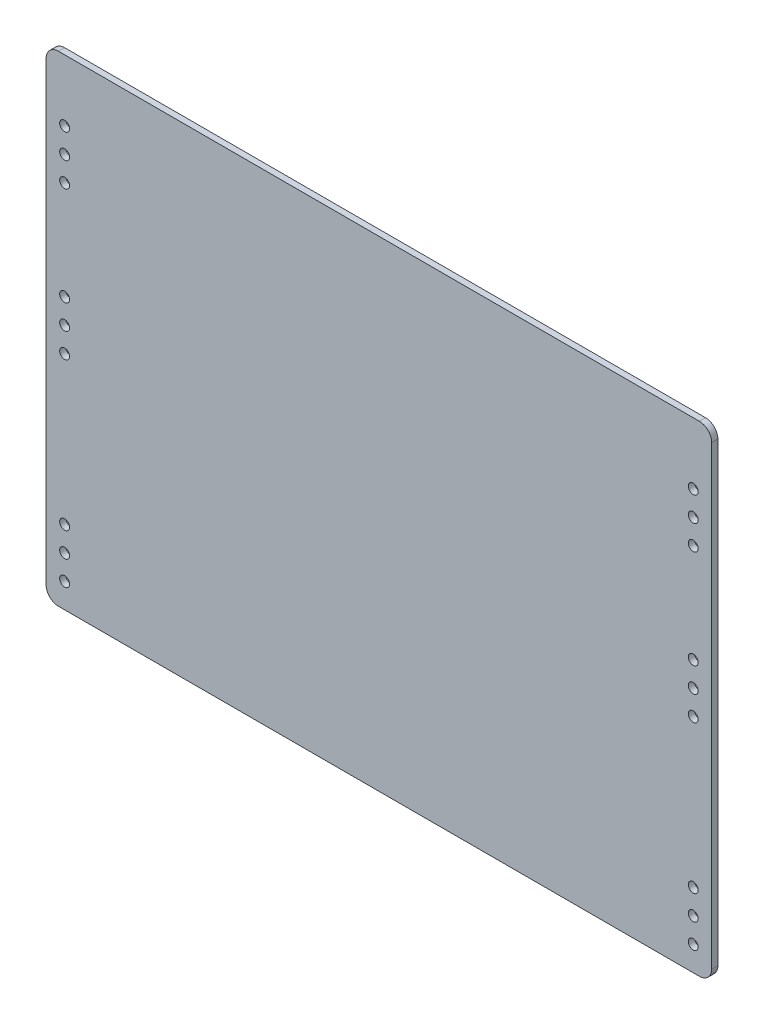
ISO-10303-21;
HEADER;
FILE_DESCRIPTION(('STEP AP214'),'2;1');
FILE_NAME('part.step','',(''),(''),'','','');
FILE_SCHEMA(('AUTOMOTIVE_DESIGN { 1 0 10303 214 1 1 1 1 }'));
ENDSEC;
DATA;
#1=APPLICATION_CONTEXT('core data for automotive mechanical design processes');
#2=APPLICATION_PROTOCOL_DEFINITION('international standard','automotive_design',2000,#1);
#3=PRODUCT_CONTEXT('',#1,'mechanical');
#4=PRODUCT('Part','Part','',(#3));
#5=PRODUCT_RELATED_PRODUCT_CATEGORY('part','',(#4));
#6=PRODUCT_DEFINITION_FORMATION('','',#4);
#7=PRODUCT_DEFINITION_CONTEXT('part definition',#1,'design');
#8=PRODUCT_DEFINITION('design','',#6,#7);
#9=PRODUCT_DEFINITION_SHAPE('','',#8);
#10=(LENGTH_UNIT() NAMED_UNIT(*) SI_UNIT(.MILLI.,.METRE.));
#11=(NAMED_UNIT(*) PLANE_ANGLE_UNIT() SI_UNIT($,.RADIAN.));
#12=(NAMED_UNIT(*) SI_UNIT($,.STERADIAN.) SOLID_ANGLE_UNIT());
#13=UNCERTAINTY_MEASURE_WITH_UNIT(LENGTH_MEASURE(1.E-05),#10,'distance_accuracy_value','');
#14=(GEOMETRIC_REPRESENTATION_CONTEXT(3) GLOBAL_UNCERTAINTY_ASSIGNED_CONTEXT((#13)) GLOBAL_UNIT_ASSIGNED_CONTEXT((#10,
#11,#12)) REPRESENTATION_CONTEXT('',''));
#15=CARTESIAN_POINT('',(0.,0.,0.));
#16=DIRECTION('',(0.,0.,1.));
#17=DIRECTION('',(1.,0.,0.));
#18=AXIS2_PLACEMENT_3D('',#15,#16,#17);
#19=CARTESIAN_POINT('',(0.,0.,3.175));
#20=DIRECTION('',(0.,0.,-1.));
#21=DIRECTION('',(-1.,0.,0.));
#22=AXIS2_PLACEMENT_3D('',#19,#20,#21);
#23=PLANE('',#22);
#24=DIRECTION('',(-1.,0.,0.));
#25=VECTOR('',#24,1.);
#26=CARTESIAN_POINT('',(0.,247.65,3.175));
#27=LINE('',#26,#25);
#28=CARTESIAN_POINT('',(336.55,247.65,3.175));
#29=VERTEX_POINT('',#28);
#30=CARTESIAN_POINT('',(6.35,247.65,3.175));
#31=VERTEX_POINT('',#30);
#32=EDGE_CURVE('E138',#29,#31,#27,.T.);
#33=ORIENTED_EDGE('',*,*,#32,.T.);
#34=CARTESIAN_POINT('',(6.35,241.3,3.175));
#35=DIRECTION('',(0.,0.,-1.));
#36=DIRECTION('',(-1.,0.,0.));
#37=AXIS2_PLACEMENT_3D('',#34,#35,#36);
#38=CIRCLE('',#37,6.35);
#39=CARTESIAN_POINT('',(0.,241.3,3.175));
#40=VERTEX_POINT('',#39);
#41=EDGE_CURVE('E156',#31,#40,#38,.F.);
#42=ORIENTED_EDGE('',*,*,#41,.T.);
#43=DIRECTION('',(0.,-1.,0.));
#44=VECTOR('',#43,1.);
#45=CARTESIAN_POINT('',(0.,0.,3.175));
#46=LINE('',#45,#44);
#47=CARTESIAN_POINT('',(0.,6.35,3.175));
#48=VERTEX_POINT('',#47);
#49=EDGE_CURVE('E120',#40,#48,#46,.T.);
#50=ORIENTED_EDGE('',*,*,#49,.T.);
#51=CARTESIAN_POINT('',(6.35,6.35,3.175));
#52=DIRECTION('',(0.,0.,-1.));
#53=DIRECTION('',(-1.,0.,0.));
#54=AXIS2_PLACEMENT_3D('',#51,#52,#53);
#55=CIRCLE('',#54,6.35);
#56=CARTESIAN_POINT('',(6.35,0.,3.175));
#57=VERTEX_POINT('',#56);
#58=EDGE_CURVE('E153',#48,#57,#55,.F.);
#59=ORIENTED_EDGE('',*,*,#58,.T.);
#60=DIRECTION('',(1.,0.,0.));
#61=VECTOR('',#60,1.);
#62=CARTESIAN_POINT('',(0.,0.,3.175));
#63=LINE('',#62,#61);
#64=CARTESIAN_POINT('',(336.55,0.,3.175));
#65=VERTEX_POINT('',#64);
#66=EDGE_CURVE('E167',#57,#65,#63,.T.);
#67=ORIENTED_EDGE('',*,*,#66,.T.);
#68=CARTESIAN_POINT('',(336.55,6.35,3.175));
#69=DIRECTION('',(0.,0.,-1.));
#70=DIRECTION('',(-1.,0.,0.));
#71=AXIS2_PLACEMENT_3D('',#68,#69,#70);
#72=CIRCLE('',#71,6.35);
#73=CARTESIAN_POINT('',(342.9,6.35,3.175));
#74=VERTEX_POINT('',#73);
#75=EDGE_CURVE('E56',#65,#74,#72,.F.);
#76=ORIENTED_EDGE('',*,*,#75,.T.);
#77=DIRECTION('',(0.,1.,0.));
#78=VECTOR('',#77,1.);
#79=CARTESIAN_POINT('',(342.9,0.,3.175));
#80=LINE('',#79,#78);
#81=CARTESIAN_POINT('',(342.9,241.3,3.175));
#82=VERTEX_POINT('',#81);
#83=EDGE_CURVE('E175',#74,#82,#80,.T.);
#84=ORIENTED_EDGE('',*,*,#83,.T.);
#85=CARTESIAN_POINT('',(336.55,241.3,3.175));
#86=DIRECTION('',(0.,0.,-1.));
#87=DIRECTION('',(-1.,0.,0.));
#88=AXIS2_PLACEMENT_3D('',#85,#86,#87);
#89=CIRCLE('',#88,6.35);
#90=EDGE_CURVE('E151',#82,#29,#89,.F.);
#91=ORIENTED_EDGE('',*,*,#90,.T.);
#92=EDGE_LOOP('',(#33,#42,#50,#59,#67,#76,#84,#91));
#93=FACE_BOUND('',#92,.T.);
#94=CARTESIAN_POINT('',(9.52500000000003,12.7000000000001,3.175));
#95=DIRECTION('',(0.,0.,1.));
#96=DIRECTION('',(1.,0.,0.));
#97=AXIS2_PLACEMENT_3D('',#94,#95,#96);
#98=CIRCLE('',#97,2.5527);
#99=CARTESIAN_POINT('',(12.0777,12.7000000000001,3.175));
#100=VERTEX_POINT('',#99);
#101=EDGE_CURVE('E129',#100,#100,#98,.T.);
#102=ORIENTED_EDGE('',*,*,#101,.F.);
#103=EDGE_LOOP('',(#102));
#104=FACE_BOUND('',#103,.T.);
#105=CARTESIAN_POINT('',(9.52500000000003,25.4000000000001,3.175));
#106=DIRECTION('',(0.,0.,1.));
#107=DIRECTION('',(1.,0.,0.));
#108=AXIS2_PLACEMENT_3D('',#105,#106,#107);
#109=CIRCLE('',#108,2.5527);
#110=CARTESIAN_POINT('',(12.0777,25.4000000000001,3.175));
#111=VERTEX_POINT('',#110);
#112=EDGE_CURVE('E182',#111,#111,#109,.T.);
#113=ORIENTED_EDGE('',*,*,#112,.F.);
#114=EDGE_LOOP('',(#113));
#115=FACE_BOUND('',#114,.T.);
#116=CARTESIAN_POINT('',(9.52500000000003,38.1000000000001,3.175));
#117=DIRECTION('',(0.,0.,1.));
#118=DIRECTION('',(1.,0.,0.));
#119=AXIS2_PLACEMENT_3D('',#116,#117,#118);
#120=CIRCLE('',#119,2.5527);
#121=CARTESIAN_POINT('',(12.0777,38.1000000000001,3.175));
#122=VERTEX_POINT('',#121);
#123=EDGE_CURVE('E187',#122,#122,#120,.T.);
#124=ORIENTED_EDGE('',*,*,#123,.F.);
#125=EDGE_LOOP('',(#124));
#126=FACE_BOUND('',#125,.T.);
#127=CARTESIAN_POINT('',(9.52500000000002,114.3,3.175));
#128=DIRECTION('',(0.,0.,1.));
#129=DIRECTION('',(1.,0.,0.));
#130=AXIS2_PLACEMENT_3D('',#127,#128,#129);
#131=CIRCLE('',#130,2.55269999999999);
#132=CARTESIAN_POINT('',(12.0777,114.3,3.175));
#133=VERTEX_POINT('',#132);
#134=EDGE_CURVE('E193',#133,#133,#131,.T.);
#135=ORIENTED_EDGE('',*,*,#134,.F.);
#136=EDGE_LOOP('',(#135));
#137=FACE_BOUND('',#136,.T.);
#138=CARTESIAN_POINT('',(9.52500000000002,127.,3.175));
#139=DIRECTION('',(0.,0.,1.));
#140=DIRECTION('',(1.,0.,0.));
#141=AXIS2_PLACEMENT_3D('',#138,#139,#140);
#142=CIRCLE('',#141,2.5527);
#143=CARTESIAN_POINT('',(12.0777,127.,3.175));
#144=VERTEX_POINT('',#143);
#145=EDGE_CURVE('E199',#144,#144,#142,.T.);
#146=ORIENTED_EDGE('',*,*,#145,.F.);
#147=EDGE_LOOP('',(#146));
#148=FACE_BOUND('',#147,.T.);
#149=CARTESIAN_POINT('',(9.52500000000002,139.7,3.175));
#150=DIRECTION('',(0.,0.,1.));
#151=DIRECTION('',(1.,0.,0.));
#152=AXIS2_PLACEMENT_3D('',#149,#150,#151);
#153=CIRCLE('',#152,2.55270000000001);
#154=CARTESIAN_POINT('',(12.0777,139.7,3.175));
#155=VERTEX_POINT('',#154);
#156=EDGE_CURVE('E205',#155,#155,#153,.T.);
#157=ORIENTED_EDGE('',*,*,#156,.F.);
#158=EDGE_LOOP('',(#157));
#159=FACE_BOUND('',#158,.T.);
#160=CARTESIAN_POINT('',(9.52500000000001,215.9,3.175));
#161=DIRECTION('',(0.,0.,1.));
#162=DIRECTION('',(1.,0.,0.));
#163=AXIS2_PLACEMENT_3D('',#160,#161,#162);
#164=CIRCLE('',#163,2.55270000000001);
#165=CARTESIAN_POINT('',(12.0777,215.9,3.175));
#166=VERTEX_POINT('',#165);
#167=EDGE_CURVE('E211',#166,#166,#164,.T.);
#168=ORIENTED_EDGE('',*,*,#167,.F.);
#169=EDGE_LOOP('',(#168));
#170=FACE_BOUND('',#169,.T.);
#171=CARTESIAN_POINT('',(9.52500000000001,203.2,3.175));
#172=DIRECTION('',(0.,0.,1.));
#173=DIRECTION('',(1.,0.,0.));
#174=AXIS2_PLACEMENT_3D('',#171,#172,#173);
#175=CIRCLE('',#174,2.55270000000001);
#176=CARTESIAN_POINT('',(12.0777,203.2,3.175));
#177=VERTEX_POINT('',#176);
#178=EDGE_CURVE('E217',#177,#177,#175,.T.);
#179=ORIENTED_EDGE('',*,*,#178,.F.);
#180=EDGE_LOOP('',(#179));
#181=FACE_BOUND('',#180,.T.);
#182=CARTESIAN_POINT('',(9.52500000000001,190.5,3.175));
#183=DIRECTION('',(0.,0.,1.));
#184=DIRECTION('',(1.,0.,0.));
#185=AXIS2_PLACEMENT_3D('',#182,#183,#184);
#186=CIRCLE('',#185,2.55270000000001);
#187=CARTESIAN_POINT('',(12.0777,190.5,3.175));
#188=VERTEX_POINT('',#187);
#189=EDGE_CURVE('E223',#188,#188,#186,.T.);
#190=ORIENTED_EDGE('',*,*,#189,.F.);
#191=EDGE_LOOP('',(#190));
#192=FACE_BOUND('',#191,.T.);
#193=CARTESIAN_POINT('',(333.375,215.9,3.175));
#194=DIRECTION('',(0.,0.,1.));
#195=DIRECTION('',(-1.,0.,0.));
#196=AXIS2_PLACEMENT_3D('',#193,#194,#195);
#197=CIRCLE('',#196,2.55269999999998);
#198=CARTESIAN_POINT('',(330.8223,215.9,3.175));
#199=VERTEX_POINT('',#198);
#200=EDGE_CURVE('E229',#199,#199,#197,.T.);
#201=ORIENTED_EDGE('',*,*,#200,.F.);
#202=EDGE_LOOP('',(#201));
#203=FACE_BOUND('',#202,.T.);
#204=CARTESIAN_POINT('',(333.375,203.2,3.175));
#205=DIRECTION('',(0.,0.,1.));
#206=DIRECTION('',(-1.,0.,0.));
#207=AXIS2_PLACEMENT_3D('',#204,#205,#206);
#208=CIRCLE('',#207,2.55269999999993);
#209=CARTESIAN_POINT('',(330.8223,203.2,3.175));
#210=VERTEX_POINT('',#209);
#211=EDGE_CURVE('E235',#210,#210,#208,.T.);
#212=ORIENTED_EDGE('',*,*,#211,.F.);
#213=EDGE_LOOP('',(#212));
#214=FACE_BOUND('',#213,.T.);
#215=CARTESIAN_POINT('',(333.375,190.5,3.175));
#216=DIRECTION('',(0.,0.,1.));
#217=DIRECTION('',(-1.,0.,0.));
#218=AXIS2_PLACEMENT_3D('',#215,#216,#217);
#219=CIRCLE('',#218,2.55269999999998);
#220=CARTESIAN_POINT('',(330.8223,190.5,3.175));
#221=VERTEX_POINT('',#220);
#222=EDGE_CURVE('E241',#221,#221,#219,.T.);
#223=ORIENTED_EDGE('',*,*,#222,.F.);
#224=EDGE_LOOP('',(#223));
#225=FACE_BOUND('',#224,.T.);
#226=CARTESIAN_POINT('',(333.375,139.7,3.175));
#227=DIRECTION('',(0.,0.,1.));
#228=DIRECTION('',(-1.,0.,0.));
#229=AXIS2_PLACEMENT_3D('',#226,#227,#228);
#230=CIRCLE('',#229,2.55270000000004);
#231=CARTESIAN_POINT('',(330.8223,139.7,3.175));
#232=VERTEX_POINT('',#231);
#233=EDGE_CURVE('E247',#232,#232,#230,.T.);
#234=ORIENTED_EDGE('',*,*,#233,.F.);
#235=EDGE_LOOP('',(#234));
#236=FACE_BOUND('',#235,.T.);
#237=CARTESIAN_POINT('',(333.375,127.,3.175));
#238=DIRECTION('',(0.,0.,1.));
#239=DIRECTION('',(-1.,0.,0.));
#240=AXIS2_PLACEMENT_3D('',#237,#238,#239);
#241=CIRCLE('',#240,2.55270000000004);
#242=CARTESIAN_POINT('',(330.8223,127.,3.175));
#243=VERTEX_POINT('',#242);
#244=EDGE_CURVE('E253',#243,#243,#241,.T.);
#245=ORIENTED_EDGE('',*,*,#244,.F.);
#246=EDGE_LOOP('',(#245));
#247=FACE_BOUND('',#246,.T.);
#248=CARTESIAN_POINT('',(333.375,114.3,3.175));
#249=DIRECTION('',(0.,0.,1.));
#250=DIRECTION('',(-1.,0.,0.));
#251=AXIS2_PLACEMENT_3D('',#248,#249,#250);
#252=CIRCLE('',#251,2.55270000000004);
#253=CARTESIAN_POINT('',(330.8223,114.3,3.175));
#254=VERTEX_POINT('',#253);
#255=EDGE_CURVE('E259',#254,#254,#252,.T.);
#256=ORIENTED_EDGE('',*,*,#255,.F.);
#257=EDGE_LOOP('',(#256));
#258=FACE_BOUND('',#257,.T.);
#259=CARTESIAN_POINT('',(333.375,38.1000000000001,3.175));
#260=DIRECTION('',(0.,0.,1.));
#261=DIRECTION('',(-1.,0.,0.));
#262=AXIS2_PLACEMENT_3D('',#259,#260,#261);
#263=CIRCLE('',#262,2.55269999999998);
#264=CARTESIAN_POINT('',(330.8223,38.1000000000001,3.175));
#265=VERTEX_POINT('',#264);
#266=EDGE_CURVE('E265',#265,#265,#263,.T.);
#267=ORIENTED_EDGE('',*,*,#266,.F.);
#268=EDGE_LOOP('',(#267));
#269=FACE_BOUND('',#268,.T.);
#270=CARTESIAN_POINT('',(333.375,25.4000000000001,3.175));
#271=DIRECTION('',(0.,0.,1.));
#272=DIRECTION('',(-1.,0.,0.));
#273=AXIS2_PLACEMENT_3D('',#270,#271,#272);
#274=CIRCLE('',#273,2.55269999999998);
#275=CARTESIAN_POINT('',(330.8223,25.4000000000001,3.175));
#276=VERTEX_POINT('',#275);
#277=EDGE_CURVE('E271',#276,#276,#274,.T.);
#278=ORIENTED_EDGE('',*,*,#277,.F.);
#279=EDGE_LOOP('',(#278));
#280=FACE_BOUND('',#279,.T.);
#281=CARTESIAN_POINT('',(333.375,12.7000000000001,3.175));
#282=DIRECTION('',(0.,0.,1.));
#283=DIRECTION('',(-1.,0.,0.));
#284=AXIS2_PLACEMENT_3D('',#281,#282,#283);
#285=CIRCLE('',#284,2.55269999999998);
#286=CARTESIAN_POINT('',(330.8223,12.7000000000001,3.175));
#287=VERTEX_POINT('',#286);
#288=EDGE_CURVE('E277',#287,#287,#285,.T.);
#289=ORIENTED_EDGE('',*,*,#288,.F.);
#290=EDGE_LOOP('',(#289));
#291=FACE_BOUND('',#290,.T.);
#292=ADVANCED_FACE('F34',(#93,#104,#115,#126,#137,#148,#159,#170,#181,#192,#203,#214,#225,#236,
#247,#258,#269,#280,#291),#23,.F.);
#293=CARTESIAN_POINT('',(0.,0.,0.));
#294=DIRECTION('',(0.,0.,-1.));
#295=DIRECTION('',(-1.,0.,0.));
#296=AXIS2_PLACEMENT_3D('',#293,#294,#295);
#297=PLANE('',#296);
#298=CARTESIAN_POINT('',(333.375,25.4000000000001,0.));
#299=DIRECTION('',(0.,0.,1.));
#300=DIRECTION('',(-1.,0.,0.));
#301=AXIS2_PLACEMENT_3D('',#298,#299,#300);
#302=CIRCLE('',#301,2.55269999999998);
#303=CARTESIAN_POINT('',(330.8223,25.4000000000001,0.));
#304=VERTEX_POINT('',#303);
#305=EDGE_CURVE('E274',#304,#304,#302,.T.);
#306=ORIENTED_EDGE('',*,*,#305,.T.);
#307=EDGE_LOOP('',(#306));
#308=FACE_BOUND('',#307,.T.);
#309=CARTESIAN_POINT('',(333.375,114.3,0.));
#310=DIRECTION('',(0.,0.,1.));
#311=DIRECTION('',(-1.,0.,0.));
#312=AXIS2_PLACEMENT_3D('',#309,#310,#311);
#313=CIRCLE('',#312,2.55270000000004);
#314=CARTESIAN_POINT('',(330.8223,114.3,0.));
#315=VERTEX_POINT('',#314);
#316=EDGE_CURVE('E262',#315,#315,#313,.T.);
#317=ORIENTED_EDGE('',*,*,#316,.T.);
#318=EDGE_LOOP('',(#317));
#319=FACE_BOUND('',#318,.T.);
#320=CARTESIAN_POINT('',(333.375,139.7,0.));
#321=DIRECTION('',(0.,0.,1.));
#322=DIRECTION('',(-1.,0.,0.));
#323=AXIS2_PLACEMENT_3D('',#320,#321,#322);
#324=CIRCLE('',#323,2.55270000000004);
#325=CARTESIAN_POINT('',(330.8223,139.7,0.));
#326=VERTEX_POINT('',#325);
#327=EDGE_CURVE('E250',#326,#326,#324,.T.);
#328=ORIENTED_EDGE('',*,*,#327,.T.);
#329=EDGE_LOOP('',(#328));
#330=FACE_BOUND('',#329,.T.);
#331=CARTESIAN_POINT('',(333.375,203.2,0.));
#332=DIRECTION('',(0.,0.,1.));
#333=DIRECTION('',(-1.,0.,0.));
#334=AXIS2_PLACEMENT_3D('',#331,#332,#333);
#335=CIRCLE('',#334,2.55269999999993);
#336=CARTESIAN_POINT('',(330.8223,203.2,0.));
#337=VERTEX_POINT('',#336);
#338=EDGE_CURVE('E238',#337,#337,#335,.T.);
#339=ORIENTED_EDGE('',*,*,#338,.T.);
#340=EDGE_LOOP('',(#339));
#341=FACE_BOUND('',#340,.T.);
#342=CARTESIAN_POINT('',(9.52500000000001,190.5,0.));
#343=DIRECTION('',(0.,0.,1.));
#344=DIRECTION('',(1.,0.,0.));
#345=AXIS2_PLACEMENT_3D('',#342,#343,#344);
#346=CIRCLE('',#345,2.55270000000001);
#347=CARTESIAN_POINT('',(12.0777,190.5,0.));
#348=VERTEX_POINT('',#347);
#349=EDGE_CURVE('E226',#348,#348,#346,.T.);
#350=ORIENTED_EDGE('',*,*,#349,.T.);
#351=EDGE_LOOP('',(#350));
#352=FACE_BOUND('',#351,.T.);
#353=CARTESIAN_POINT('',(9.52500000000001,215.9,0.));
#354=DIRECTION('',(0.,0.,1.));
#355=DIRECTION('',(1.,0.,0.));
#356=AXIS2_PLACEMENT_3D('',#353,#354,#355);
#357=CIRCLE('',#356,2.55270000000001);
#358=CARTESIAN_POINT('',(12.0777,215.9,0.));
#359=VERTEX_POINT('',#358);
#360=EDGE_CURVE('E214',#359,#359,#357,.T.);
#361=ORIENTED_EDGE('',*,*,#360,.T.);
#362=EDGE_LOOP('',(#361));
#363=FACE_BOUND('',#362,.T.);
#364=CARTESIAN_POINT('',(9.52500000000002,127.,0.));
#365=DIRECTION('',(0.,0.,1.));
#366=DIRECTION('',(1.,0.,0.));
#367=AXIS2_PLACEMENT_3D('',#364,#365,#366);
#368=CIRCLE('',#367,2.5527);
#369=CARTESIAN_POINT('',(12.0777,127.,0.));
#370=VERTEX_POINT('',#369);
#371=EDGE_CURVE('E202',#370,#370,#368,.T.);
#372=ORIENTED_EDGE('',*,*,#371,.T.);
#373=EDGE_LOOP('',(#372));
#374=FACE_BOUND('',#373,.T.);
#375=CARTESIAN_POINT('',(9.52500000000003,38.1000000000001,0.));
#376=DIRECTION('',(0.,0.,1.));
#377=DIRECTION('',(1.,0.,0.));
#378=AXIS2_PLACEMENT_3D('',#375,#376,#377);
#379=CIRCLE('',#378,2.5527);
#380=CARTESIAN_POINT('',(12.0777,38.1000000000001,0.));
#381=VERTEX_POINT('',#380);
#382=EDGE_CURVE('E190',#381,#381,#379,.T.);
#383=ORIENTED_EDGE('',*,*,#382,.T.);
#384=EDGE_LOOP('',(#383));
#385=FACE_BOUND('',#384,.T.);
#386=CARTESIAN_POINT('',(9.52500000000003,12.7000000000001,0.));
#387=DIRECTION('',(0.,0.,1.));
#388=DIRECTION('',(1.,0.,0.));
#389=AXIS2_PLACEMENT_3D('',#386,#387,#388);
#390=CIRCLE('',#389,2.5527);
#391=CARTESIAN_POINT('',(12.0777,12.7000000000001,0.));
#392=VERTEX_POINT('',#391);
#393=EDGE_CURVE('E135',#392,#392,#390,.T.);
#394=ORIENTED_EDGE('',*,*,#393,.T.);
#395=EDGE_LOOP('',(#394));
#396=FACE_BOUND('',#395,.T.);
#397=DIRECTION('',(0.,-1.,0.));
#398=VECTOR('',#397,1.);
#399=CARTESIAN_POINT('',(0.,0.,0.));
#400=LINE('',#399,#398);
#401=CARTESIAN_POINT('',(0.,241.3,0.));
#402=VERTEX_POINT('',#401);
#403=CARTESIAN_POINT('',(0.,6.35,0.));
#404=VERTEX_POINT('',#403);
#405=EDGE_CURVE('E117',#402,#404,#400,.T.);
#406=ORIENTED_EDGE('',*,*,#405,.F.);
#407=CARTESIAN_POINT('',(6.35,241.3,0.));
#408=DIRECTION('',(0.,0.,-1.));
#409=DIRECTION('',(-1.,0.,0.));
#410=AXIS2_PLACEMENT_3D('',#407,#408,#409);
#411=CIRCLE('',#410,6.35);
#412=CARTESIAN_POINT('',(6.35,247.65,0.));
#413=VERTEX_POINT('',#412);
#414=EDGE_CURVE('E100',#402,#413,#411,.T.);
#415=ORIENTED_EDGE('',*,*,#414,.T.);
#416=DIRECTION('',(-1.,0.,0.));
#417=VECTOR('',#416,1.);
#418=CARTESIAN_POINT('',(0.,247.65,0.));
#419=LINE('',#418,#417);
#420=CARTESIAN_POINT('',(336.55,247.65,0.));
#421=VERTEX_POINT('',#420);
#422=EDGE_CURVE('E142',#421,#413,#419,.T.);
#423=ORIENTED_EDGE('',*,*,#422,.F.);
#424=CARTESIAN_POINT('',(336.55,241.3,0.));
#425=DIRECTION('',(0.,0.,-1.));
#426=DIRECTION('',(-1.,0.,0.));
#427=AXIS2_PLACEMENT_3D('',#424,#425,#426);
#428=CIRCLE('',#427,6.35);
#429=CARTESIAN_POINT('',(342.9,241.3,0.));
#430=VERTEX_POINT('',#429);
#431=EDGE_CURVE('E121',#421,#430,#428,.T.);
#432=ORIENTED_EDGE('',*,*,#431,.T.);
#433=DIRECTION('',(0.,1.,0.));
#434=VECTOR('',#433,1.);
#435=CARTESIAN_POINT('',(342.9,0.,0.));
#436=LINE('',#435,#434);
#437=CARTESIAN_POINT('',(342.9,6.35,0.));
#438=VERTEX_POINT('',#437);
#439=EDGE_CURVE('E132',#438,#430,#436,.T.);
#440=ORIENTED_EDGE('',*,*,#439,.F.);
#441=CARTESIAN_POINT('',(336.55,6.35,0.));
#442=DIRECTION('',(0.,0.,-1.));
#443=DIRECTION('',(-1.,0.,0.));
#444=AXIS2_PLACEMENT_3D('',#441,#442,#443);
#445=CIRCLE('',#444,6.35);
#446=CARTESIAN_POINT('',(336.55,0.,0.));
#447=VERTEX_POINT('',#446);
#448=EDGE_CURVE('E111',#438,#447,#445,.T.);
#449=ORIENTED_EDGE('',*,*,#448,.T.);
#450=DIRECTION('',(1.,0.,0.));
#451=VECTOR('',#450,1.);
#452=CARTESIAN_POINT('',(0.,0.,0.));
#453=LINE('',#452,#451);
#454=CARTESIAN_POINT('',(6.35,0.,0.));
#455=VERTEX_POINT('',#454);
#456=EDGE_CURVE('E128',#455,#447,#453,.T.);
#457=ORIENTED_EDGE('',*,*,#456,.F.);
#458=CARTESIAN_POINT('',(6.35,6.35,0.));
#459=DIRECTION('',(0.,0.,-1.));
#460=DIRECTION('',(-1.,0.,0.));
#461=AXIS2_PLACEMENT_3D('',#458,#459,#460);
#462=CIRCLE('',#461,6.35);
#463=EDGE_CURVE('E127',#455,#404,#462,.T.);
#464=ORIENTED_EDGE('',*,*,#463,.T.);
#465=EDGE_LOOP('',(#406,#415,#423,#432,#440,#449,#457,#464));
#466=FACE_BOUND('',#465,.T.);
#467=CARTESIAN_POINT('',(9.52500000000003,25.4000000000001,0.));
#468=DIRECTION('',(0.,0.,1.));
#469=DIRECTION('',(1.,0.,0.));
#470=AXIS2_PLACEMENT_3D('',#467,#468,#469);
#471=CIRCLE('',#470,2.5527);
#472=CARTESIAN_POINT('',(12.0777,25.4000000000001,0.));
#473=VERTEX_POINT('',#472);
#474=EDGE_CURVE('E184',#473,#473,#471,.T.);
#475=ORIENTED_EDGE('',*,*,#474,.T.);
#476=EDGE_LOOP('',(#475));
#477=FACE_BOUND('',#476,.T.);
#478=CARTESIAN_POINT('',(9.52500000000002,114.3,0.));
#479=DIRECTION('',(0.,0.,1.));
#480=DIRECTION('',(1.,0.,0.));
#481=AXIS2_PLACEMENT_3D('',#478,#479,#480);
#482=CIRCLE('',#481,2.55269999999999);
#483=CARTESIAN_POINT('',(12.0777,114.3,0.));
#484=VERTEX_POINT('',#483);
#485=EDGE_CURVE('E196',#484,#484,#482,.T.);
#486=ORIENTED_EDGE('',*,*,#485,.T.);
#487=EDGE_LOOP('',(#486));
#488=FACE_BOUND('',#487,.T.);
#489=CARTESIAN_POINT('',(9.52500000000002,139.7,0.));
#490=DIRECTION('',(0.,0.,1.));
#491=DIRECTION('',(1.,0.,0.));
#492=AXIS2_PLACEMENT_3D('',#489,#490,#491);
#493=CIRCLE('',#492,2.55270000000001);
#494=CARTESIAN_POINT('',(12.0777,139.7,0.));
#495=VERTEX_POINT('',#494);
#496=EDGE_CURVE('E208',#495,#495,#493,.T.);
#497=ORIENTED_EDGE('',*,*,#496,.T.);
#498=EDGE_LOOP('',(#497));
#499=FACE_BOUND('',#498,.T.);
#500=CARTESIAN_POINT('',(9.52500000000001,203.2,0.));
#501=DIRECTION('',(0.,0.,1.));
#502=DIRECTION('',(1.,0.,0.));
#503=AXIS2_PLACEMENT_3D('',#500,#501,#502);
#504=CIRCLE('',#503,2.55270000000001);
#505=CARTESIAN_POINT('',(12.0777,203.2,0.));
#506=VERTEX_POINT('',#505);
#507=EDGE_CURVE('E220',#506,#506,#504,.T.);
#508=ORIENTED_EDGE('',*,*,#507,.T.);
#509=EDGE_LOOP('',(#508));
#510=FACE_BOUND('',#509,.T.);
#511=CARTESIAN_POINT('',(333.375,215.9,0.));
#512=DIRECTION('',(0.,0.,1.));
#513=DIRECTION('',(-1.,0.,0.));
#514=AXIS2_PLACEMENT_3D('',#511,#512,#513);
#515=CIRCLE('',#514,2.55269999999998);
#516=CARTESIAN_POINT('',(330.8223,215.9,0.));
#517=VERTEX_POINT('',#516);
#518=EDGE_CURVE('E232',#517,#517,#515,.T.);
#519=ORIENTED_EDGE('',*,*,#518,.T.);
#520=EDGE_LOOP('',(#519));
#521=FACE_BOUND('',#520,.T.);
#522=CARTESIAN_POINT('',(333.375,190.5,0.));
#523=DIRECTION('',(0.,0.,1.));
#524=DIRECTION('',(-1.,0.,0.));
#525=AXIS2_PLACEMENT_3D('',#522,#523,#524);
#526=CIRCLE('',#525,2.55269999999998);
#527=CARTESIAN_POINT('',(330.8223,190.5,0.));
#528=VERTEX_POINT('',#527);
#529=EDGE_CURVE('E244',#528,#528,#526,.T.);
#530=ORIENTED_EDGE('',*,*,#529,.T.);
#531=EDGE_LOOP('',(#530));
#532=FACE_BOUND('',#531,.T.);
#533=CARTESIAN_POINT('',(333.375,127.,0.));
#534=DIRECTION('',(0.,0.,1.));
#535=DIRECTION('',(-1.,0.,0.));
#536=AXIS2_PLACEMENT_3D('',#533,#534,#535);
#537=CIRCLE('',#536,2.55270000000004);
#538=CARTESIAN_POINT('',(330.8223,127.,0.));
#539=VERTEX_POINT('',#538);
#540=EDGE_CURVE('E256',#539,#539,#537,.T.);
#541=ORIENTED_EDGE('',*,*,#540,.T.);
#542=EDGE_LOOP('',(#541));
#543=FACE_BOUND('',#542,.T.);
#544=CARTESIAN_POINT('',(333.375,38.1000000000001,0.));
#545=DIRECTION('',(0.,0.,1.));
#546=DIRECTION('',(-1.,0.,0.));
#547=AXIS2_PLACEMENT_3D('',#544,#545,#546);
#548=CIRCLE('',#547,2.55269999999998);
#549=CARTESIAN_POINT('',(330.8223,38.1000000000001,0.));
#550=VERTEX_POINT('',#549);
#551=EDGE_CURVE('E268',#550,#550,#548,.T.);
#552=ORIENTED_EDGE('',*,*,#551,.T.);
#553=EDGE_LOOP('',(#552));
#554=FACE_BOUND('',#553,.T.);
#555=CARTESIAN_POINT('',(333.375,12.7000000000001,0.));
#556=DIRECTION('',(0.,0.,1.));
#557=DIRECTION('',(-1.,0.,0.));
#558=AXIS2_PLACEMENT_3D('',#555,#556,#557);
#559=CIRCLE('',#558,2.55269999999998);
#560=CARTESIAN_POINT('',(330.8223,12.7000000000001,0.));
#561=VERTEX_POINT('',#560);
#562=EDGE_CURVE('E280',#561,#561,#559,.T.);
#563=ORIENTED_EDGE('',*,*,#562,.T.);
#564=EDGE_LOOP('',(#563));
#565=FACE_BOUND('',#564,.T.);
#566=ADVANCED_FACE('F124',(#308,#319,#330,#341,#352,#363,#374,#385,#396,#466,#477,#488,#499,
#510,#521,#532,#543,#554,#565),#297,.T.);
#567=CARTESIAN_POINT('',(0.,0.,3.175));
#568=DIRECTION('',(1.,0.,0.));
#569=DIRECTION('',(0.,0.,-1.));
#570=AXIS2_PLACEMENT_3D('',#567,#568,#569);
#571=PLANE('',#570);
#572=ORIENTED_EDGE('',*,*,#49,.F.);
#573=DIRECTION('',(0.,0.,-1.));
#574=VECTOR('',#573,1.);
#575=CARTESIAN_POINT('',(0.,241.3,3.175));
#576=LINE('',#575,#574);
#577=EDGE_CURVE('E104',#40,#402,#576,.T.);
#578=ORIENTED_EDGE('',*,*,#577,.T.);
#579=ORIENTED_EDGE('',*,*,#405,.T.);
#580=DIRECTION('',(0.,0.,-1.));
#581=VECTOR('',#580,1.);
#582=CARTESIAN_POINT('',(0.,6.35,3.175));
#583=LINE('',#582,#581);
#584=EDGE_CURVE('E122',#404,#48,#583,.F.);
#585=ORIENTED_EDGE('',*,*,#584,.T.);
#586=EDGE_LOOP('',(#572,#578,#579,#585));
#587=FACE_BOUND('',#586,.T.);
#588=ADVANCED_FACE('F116',(#587),#571,.F.);
#589=CARTESIAN_POINT('',(0.,0.,3.175));
#590=DIRECTION('',(0.,1.,0.));
#591=DIRECTION('',(0.,0.,1.));
#592=AXIS2_PLACEMENT_3D('',#589,#590,#591);
#593=PLANE('',#592);
#594=ORIENTED_EDGE('',*,*,#456,.T.);
#595=DIRECTION('',(0.,0.,-1.));
#596=VECTOR('',#595,1.);
#597=CARTESIAN_POINT('',(336.55,0.,3.175));
#598=LINE('',#597,#596);
#599=EDGE_CURVE('E11',#447,#65,#598,.F.);
#600=ORIENTED_EDGE('',*,*,#599,.T.);
#601=ORIENTED_EDGE('',*,*,#66,.F.);
#602=DIRECTION('',(0.,0.,-1.));
#603=VECTOR('',#602,1.);
#604=CARTESIAN_POINT('',(6.35,0.,3.175));
#605=LINE('',#604,#603);
#606=EDGE_CURVE('E42',#57,#455,#605,.T.);
#607=ORIENTED_EDGE('',*,*,#606,.T.);
#608=EDGE_LOOP('',(#594,#600,#601,#607));
#609=FACE_BOUND('',#608,.T.);
#610=ADVANCED_FACE('F165',(#609),#593,.F.);
#611=CARTESIAN_POINT('',(342.9,0.,3.175));
#612=DIRECTION('',(-1.,0.,0.));
#613=DIRECTION('',(0.,0.,1.));
#614=AXIS2_PLACEMENT_3D('',#611,#612,#613);
#615=PLANE('',#614);
#616=ORIENTED_EDGE('',*,*,#83,.F.);
#617=DIRECTION('',(0.,0.,-1.));
#618=VECTOR('',#617,1.);
#619=CARTESIAN_POINT('',(342.9,6.35,3.175));
#620=LINE('',#619,#618);
#621=EDGE_CURVE('E159',#74,#438,#620,.T.);
#622=ORIENTED_EDGE('',*,*,#621,.T.);
#623=ORIENTED_EDGE('',*,*,#439,.T.);
#624=DIRECTION('',(0.,0.,-1.));
#625=VECTOR('',#624,1.);
#626=CARTESIAN_POINT('',(342.9,241.3,3.175));
#627=LINE('',#626,#625);
#628=EDGE_CURVE('E49',#430,#82,#627,.F.);
#629=ORIENTED_EDGE('',*,*,#628,.T.);
#630=EDGE_LOOP('',(#616,#622,#623,#629));
#631=FACE_BOUND('',#630,.T.);
#632=ADVANCED_FACE('F174',(#631),#615,.F.);
#633=CARTESIAN_POINT('',(0.,247.65,3.175));
#634=DIRECTION('',(0.,-1.,0.));
#635=DIRECTION('',(0.,0.,-1.));
#636=AXIS2_PLACEMENT_3D('',#633,#634,#635);
#637=PLANE('',#636);
#638=ORIENTED_EDGE('',*,*,#422,.T.);
#639=DIRECTION('',(0.,0.,-1.));
#640=VECTOR('',#639,1.);
#641=CARTESIAN_POINT('',(6.35,247.65,3.175));
#642=LINE('',#641,#640);
#643=EDGE_CURVE('E105',#413,#31,#642,.F.);
#644=ORIENTED_EDGE('',*,*,#643,.T.);
#645=ORIENTED_EDGE('',*,*,#32,.F.);
#646=DIRECTION('',(0.,0.,-1.));
#647=VECTOR('',#646,1.);
#648=CARTESIAN_POINT('',(336.55,247.65,3.175));
#649=LINE('',#648,#647);
#650=EDGE_CURVE('E110',#29,#421,#649,.T.);
#651=ORIENTED_EDGE('',*,*,#650,.T.);
#652=EDGE_LOOP('',(#638,#644,#645,#651));
#653=FACE_BOUND('',#652,.T.);
#654=ADVANCED_FACE('F301',(#653),#637,.F.);
#655=CARTESIAN_POINT('',(9.52500000000003,12.7000000000001,3.175));
#656=DIRECTION('',(0.,0.,-1.));
#657=DIRECTION('',(-1.,0.,0.));
#658=AXIS2_PLACEMENT_3D('',#655,#656,#657);
#659=CYLINDRICAL_SURFACE('',#658,2.5527);
#660=ORIENTED_EDGE('',*,*,#101,.T.);
#661=EDGE_LOOP('',(#660));
#662=FACE_BOUND('',#661,.T.);
#663=ORIENTED_EDGE('',*,*,#393,.F.);
#664=EDGE_LOOP('',(#663));
#665=FACE_BOUND('',#664,.T.);
#666=ADVANCED_FACE('F298',(#662,#665),#659,.F.);
#667=CARTESIAN_POINT('',(9.52500000000003,25.4000000000001,3.175));
#668=DIRECTION('',(0.,0.,-1.));
#669=DIRECTION('',(-1.,0.,0.));
#670=AXIS2_PLACEMENT_3D('',#667,#668,#669);
#671=CYLINDRICAL_SURFACE('',#670,2.5527);
#672=ORIENTED_EDGE('',*,*,#112,.T.);
#673=EDGE_LOOP('',(#672));
#674=FACE_BOUND('',#673,.T.);
#675=ORIENTED_EDGE('',*,*,#474,.F.);
#676=EDGE_LOOP('',(#675));
#677=FACE_BOUND('',#676,.T.);
#678=ADVANCED_FACE('F534',(#674,#677),#671,.F.);
#679=CARTESIAN_POINT('',(9.52500000000003,38.1000000000001,3.175));
#680=DIRECTION('',(0.,0.,-1.));
#681=DIRECTION('',(-1.,0.,0.));
#682=AXIS2_PLACEMENT_3D('',#679,#680,#681);
#683=CYLINDRICAL_SURFACE('',#682,2.5527);
#684=ORIENTED_EDGE('',*,*,#123,.T.);
#685=EDGE_LOOP('',(#684));
#686=FACE_BOUND('',#685,.T.);
#687=ORIENTED_EDGE('',*,*,#382,.F.);
#688=EDGE_LOOP('',(#687));
#689=FACE_BOUND('',#688,.T.);
#690=ADVANCED_FACE('F524',(#686,#689),#683,.F.);
#691=CARTESIAN_POINT('',(9.52500000000002,114.3,3.175));
#692=DIRECTION('',(0.,0.,-1.));
#693=DIRECTION('',(-1.,0.,0.));
#694=AXIS2_PLACEMENT_3D('',#691,#692,#693);
#695=CYLINDRICAL_SURFACE('',#694,2.55269999999999);
#696=ORIENTED_EDGE('',*,*,#134,.T.);
#697=EDGE_LOOP('',(#696));
#698=FACE_BOUND('',#697,.T.);
#699=ORIENTED_EDGE('',*,*,#485,.F.);
#700=EDGE_LOOP('',(#699));
#701=FACE_BOUND('',#700,.T.);
#702=ADVANCED_FACE('F514',(#698,#701),#695,.F.);
#703=CARTESIAN_POINT('',(9.52500000000002,127.,3.175));
#704=DIRECTION('',(0.,0.,-1.));
#705=DIRECTION('',(-1.,0.,0.));
#706=AXIS2_PLACEMENT_3D('',#703,#704,#705);
#707=CYLINDRICAL_SURFACE('',#706,2.5527);
#708=ORIENTED_EDGE('',*,*,#145,.T.);
#709=EDGE_LOOP('',(#708));
#710=FACE_BOUND('',#709,.T.);
#711=ORIENTED_EDGE('',*,*,#371,.F.);
#712=EDGE_LOOP('',(#711));
#713=FACE_BOUND('',#712,.T.);
#714=ADVANCED_FACE('F504',(#710,#713),#707,.F.);
#715=CARTESIAN_POINT('',(9.52500000000002,139.7,3.175));
#716=DIRECTION('',(0.,0.,-1.));
#717=DIRECTION('',(-1.,0.,0.));
#718=AXIS2_PLACEMENT_3D('',#715,#716,#717);
#719=CYLINDRICAL_SURFACE('',#718,2.55270000000001);
#720=ORIENTED_EDGE('',*,*,#156,.T.);
#721=EDGE_LOOP('',(#720));
#722=FACE_BOUND('',#721,.T.);
#723=ORIENTED_EDGE('',*,*,#496,.F.);
#724=EDGE_LOOP('',(#723));
#725=FACE_BOUND('',#724,.T.);
#726=ADVANCED_FACE('F494',(#722,#725),#719,.F.);
#727=CARTESIAN_POINT('',(9.52500000000001,215.9,3.175));
#728=DIRECTION('',(0.,0.,-1.));
#729=DIRECTION('',(-1.,0.,0.));
#730=AXIS2_PLACEMENT_3D('',#727,#728,#729);
#731=CYLINDRICAL_SURFACE('',#730,2.55270000000001);
#732=ORIENTED_EDGE('',*,*,#167,.T.);
#733=EDGE_LOOP('',(#732));
#734=FACE_BOUND('',#733,.T.);
#735=ORIENTED_EDGE('',*,*,#360,.F.);
#736=EDGE_LOOP('',(#735));
#737=FACE_BOUND('',#736,.T.);
#738=ADVANCED_FACE('F484',(#734,#737),#731,.F.);
#739=CARTESIAN_POINT('',(9.52500000000001,203.2,3.175));
#740=DIRECTION('',(0.,0.,-1.));
#741=DIRECTION('',(-1.,0.,0.));
#742=AXIS2_PLACEMENT_3D('',#739,#740,#741);
#743=CYLINDRICAL_SURFACE('',#742,2.55270000000001);
#744=ORIENTED_EDGE('',*,*,#178,.T.);
#745=EDGE_LOOP('',(#744));
#746=FACE_BOUND('',#745,.T.);
#747=ORIENTED_EDGE('',*,*,#507,.F.);
#748=EDGE_LOOP('',(#747));
#749=FACE_BOUND('',#748,.T.);
#750=ADVANCED_FACE('F474',(#746,#749),#743,.F.);
#751=CARTESIAN_POINT('',(9.52500000000001,190.5,3.175));
#752=DIRECTION('',(0.,0.,-1.));
#753=DIRECTION('',(-1.,0.,0.));
#754=AXIS2_PLACEMENT_3D('',#751,#752,#753);
#755=CYLINDRICAL_SURFACE('',#754,2.55270000000001);
#756=ORIENTED_EDGE('',*,*,#189,.T.);
#757=EDGE_LOOP('',(#756));
#758=FACE_BOUND('',#757,.T.);
#759=ORIENTED_EDGE('',*,*,#349,.F.);
#760=EDGE_LOOP('',(#759));
#761=FACE_BOUND('',#760,.T.);
#762=ADVANCED_FACE('F464',(#758,#761),#755,.F.);
#763=CARTESIAN_POINT('',(333.375,215.9,3.175));
#764=DIRECTION('',(0.,0.,-1.));
#765=DIRECTION('',(-1.,0.,0.));
#766=AXIS2_PLACEMENT_3D('',#763,#764,#765);
#767=CYLINDRICAL_SURFACE('',#766,2.55269999999998);
#768=ORIENTED_EDGE('',*,*,#200,.T.);
#769=EDGE_LOOP('',(#768));
#770=FACE_BOUND('',#769,.T.);
#771=ORIENTED_EDGE('',*,*,#518,.F.);
#772=EDGE_LOOP('',(#771));
#773=FACE_BOUND('',#772,.T.);
#774=ADVANCED_FACE('F454',(#770,#773),#767,.F.);
#775=CARTESIAN_POINT('',(333.375,203.2,3.175));
#776=DIRECTION('',(0.,0.,-1.));
#777=DIRECTION('',(-1.,0.,0.));
#778=AXIS2_PLACEMENT_3D('',#775,#776,#777);
#779=CYLINDRICAL_SURFACE('',#778,2.55269999999993);
#780=ORIENTED_EDGE('',*,*,#211,.T.);
#781=EDGE_LOOP('',(#780));
#782=FACE_BOUND('',#781,.T.);
#783=ORIENTED_EDGE('',*,*,#338,.F.);
#784=EDGE_LOOP('',(#783));
#785=FACE_BOUND('',#784,.T.);
#786=ADVANCED_FACE('F444',(#782,#785),#779,.F.);
#787=CARTESIAN_POINT('',(333.375,190.5,3.175));
#788=DIRECTION('',(0.,0.,-1.));
#789=DIRECTION('',(-1.,0.,0.));
#790=AXIS2_PLACEMENT_3D('',#787,#788,#789);
#791=CYLINDRICAL_SURFACE('',#790,2.55269999999998);
#792=ORIENTED_EDGE('',*,*,#222,.T.);
#793=EDGE_LOOP('',(#792));
#794=FACE_BOUND('',#793,.T.);
#795=ORIENTED_EDGE('',*,*,#529,.F.);
#796=EDGE_LOOP('',(#795));
#797=FACE_BOUND('',#796,.T.);
#798=ADVANCED_FACE('F434',(#794,#797),#791,.F.);
#799=CARTESIAN_POINT('',(333.375,139.7,3.175));
#800=DIRECTION('',(0.,0.,-1.));
#801=DIRECTION('',(-1.,0.,0.));
#802=AXIS2_PLACEMENT_3D('',#799,#800,#801);
#803=CYLINDRICAL_SURFACE('',#802,2.55270000000004);
#804=ORIENTED_EDGE('',*,*,#233,.T.);
#805=EDGE_LOOP('',(#804));
#806=FACE_BOUND('',#805,.T.);
#807=ORIENTED_EDGE('',*,*,#327,.F.);
#808=EDGE_LOOP('',(#807));
#809=FACE_BOUND('',#808,.T.);
#810=ADVANCED_FACE('F424',(#806,#809),#803,.F.);
#811=CARTESIAN_POINT('',(333.375,127.,3.175));
#812=DIRECTION('',(0.,0.,-1.));
#813=DIRECTION('',(-1.,0.,0.));
#814=AXIS2_PLACEMENT_3D('',#811,#812,#813);
#815=CYLINDRICAL_SURFACE('',#814,2.55270000000004);
#816=ORIENTED_EDGE('',*,*,#244,.T.);
#817=EDGE_LOOP('',(#816));
#818=FACE_BOUND('',#817,.T.);
#819=ORIENTED_EDGE('',*,*,#540,.F.);
#820=EDGE_LOOP('',(#819));
#821=FACE_BOUND('',#820,.T.);
#822=ADVANCED_FACE('F414',(#818,#821),#815,.F.);
#823=CARTESIAN_POINT('',(333.375,114.3,3.175));
#824=DIRECTION('',(0.,0.,-1.));
#825=DIRECTION('',(-1.,0.,0.));
#826=AXIS2_PLACEMENT_3D('',#823,#824,#825);
#827=CYLINDRICAL_SURFACE('',#826,2.55270000000004);
#828=ORIENTED_EDGE('',*,*,#255,.T.);
#829=EDGE_LOOP('',(#828));
#830=FACE_BOUND('',#829,.T.);
#831=ORIENTED_EDGE('',*,*,#316,.F.);
#832=EDGE_LOOP('',(#831));
#833=FACE_BOUND('',#832,.T.);
#834=ADVANCED_FACE('F404',(#830,#833),#827,.F.);
#835=CARTESIAN_POINT('',(333.375,38.1000000000001,3.175));
#836=DIRECTION('',(0.,0.,-1.));
#837=DIRECTION('',(-1.,0.,0.));
#838=AXIS2_PLACEMENT_3D('',#835,#836,#837);
#839=CYLINDRICAL_SURFACE('',#838,2.55269999999998);
#840=ORIENTED_EDGE('',*,*,#266,.T.);
#841=EDGE_LOOP('',(#840));
#842=FACE_BOUND('',#841,.T.);
#843=ORIENTED_EDGE('',*,*,#551,.F.);
#844=EDGE_LOOP('',(#843));
#845=FACE_BOUND('',#844,.T.);
#846=ADVANCED_FACE('F394',(#842,#845),#839,.F.);
#847=CARTESIAN_POINT('',(333.375,25.4000000000001,3.175));
#848=DIRECTION('',(0.,0.,-1.));
#849=DIRECTION('',(-1.,0.,0.));
#850=AXIS2_PLACEMENT_3D('',#847,#848,#849);
#851=CYLINDRICAL_SURFACE('',#850,2.55269999999998);
#852=ORIENTED_EDGE('',*,*,#277,.T.);
#853=EDGE_LOOP('',(#852));
#854=FACE_BOUND('',#853,.T.);
#855=ORIENTED_EDGE('',*,*,#305,.F.);
#856=EDGE_LOOP('',(#855));
#857=FACE_BOUND('',#856,.T.);
#858=ADVANCED_FACE('F385',(#854,#857),#851,.F.);
#859=CARTESIAN_POINT('',(333.375,12.7000000000001,3.175));
#860=DIRECTION('',(0.,0.,-1.));
#861=DIRECTION('',(-1.,0.,0.));
#862=AXIS2_PLACEMENT_3D('',#859,#860,#861);
#863=CYLINDRICAL_SURFACE('',#862,2.55269999999998);
#864=ORIENTED_EDGE('',*,*,#288,.T.);
#865=EDGE_LOOP('',(#864));
#866=FACE_BOUND('',#865,.T.);
#867=ORIENTED_EDGE('',*,*,#562,.F.);
#868=EDGE_LOOP('',(#867));
#869=FACE_BOUND('',#868,.T.);
#870=ADVANCED_FACE('F286',(#866,#869),#863,.F.);
#871=CARTESIAN_POINT('',(6.35,241.3,3.175));
#872=DIRECTION('',(0.,0.,-1.));
#873=DIRECTION('',(-1.,0.,0.));
#874=AXIS2_PLACEMENT_3D('',#871,#872,#873);
#875=CYLINDRICAL_SURFACE('',#874,6.35);
#876=ORIENTED_EDGE('',*,*,#41,.F.);
#877=ORIENTED_EDGE('',*,*,#643,.F.);
#878=ORIENTED_EDGE('',*,*,#414,.F.);
#879=ORIENTED_EDGE('',*,*,#577,.F.);
#880=EDGE_LOOP('',(#876,#877,#878,#879));
#881=FACE_BOUND('',#880,.T.);
#882=ADVANCED_FACE('F103',(#881),#875,.T.);
#883=CARTESIAN_POINT('',(336.55,6.35,3.175));
#884=DIRECTION('',(0.,0.,-1.));
#885=DIRECTION('',(-1.,0.,0.));
#886=AXIS2_PLACEMENT_3D('',#883,#884,#885);
#887=CYLINDRICAL_SURFACE('',#886,6.35);
#888=ORIENTED_EDGE('',*,*,#75,.F.);
#889=ORIENTED_EDGE('',*,*,#599,.F.);
#890=ORIENTED_EDGE('',*,*,#448,.F.);
#891=ORIENTED_EDGE('',*,*,#621,.F.);
#892=EDGE_LOOP('',(#888,#889,#890,#891));
#893=FACE_BOUND('',#892,.T.);
#894=ADVANCED_FACE('F173',(#893),#887,.T.);
#895=CARTESIAN_POINT('',(6.35,6.35,3.175));
#896=DIRECTION('',(0.,0.,-1.));
#897=DIRECTION('',(-1.,0.,0.));
#898=AXIS2_PLACEMENT_3D('',#895,#896,#897);
#899=CYLINDRICAL_SURFACE('',#898,6.35);
#900=ORIENTED_EDGE('',*,*,#58,.F.);
#901=ORIENTED_EDGE('',*,*,#584,.F.);
#902=ORIENTED_EDGE('',*,*,#463,.F.);
#903=ORIENTED_EDGE('',*,*,#606,.F.);
#904=EDGE_LOOP('',(#900,#901,#902,#903));
#905=FACE_BOUND('',#904,.T.);
#906=ADVANCED_FACE('F314',(#905),#899,.T.);
#907=CARTESIAN_POINT('',(336.55,241.3,3.175));
#908=DIRECTION('',(0.,0.,-1.));
#909=DIRECTION('',(-1.,0.,0.));
#910=AXIS2_PLACEMENT_3D('',#907,#908,#909);
#911=CYLINDRICAL_SURFACE('',#910,6.35);
#912=ORIENTED_EDGE('',*,*,#90,.F.);
#913=ORIENTED_EDGE('',*,*,#628,.F.);
#914=ORIENTED_EDGE('',*,*,#431,.F.);
#915=ORIENTED_EDGE('',*,*,#650,.F.);
#916=EDGE_LOOP('',(#912,#913,#914,#915));
#917=FACE_BOUND('',#916,.T.);
#918=ADVANCED_FACE('F36',(#917),#911,.T.);
#919=CLOSED_SHELL('',(#292,#566,#588,#610,#632,#654,#666,#678,#690,#702,#714,#726,#738,#750,
#762,#774,#786,#798,#810,#822,#834,#846,#858,#870,#882,#894,#906,#918));
#920=MANIFOLD_SOLID_BREP('B2',#919);
#921=ADVANCED_BREP_SHAPE_REPRESENTATION('',(#18,#920),#14);
#922=SHAPE_DEFINITION_REPRESENTATION(#9,#921);
ENDSEC;
END-ISO-10303-21;
